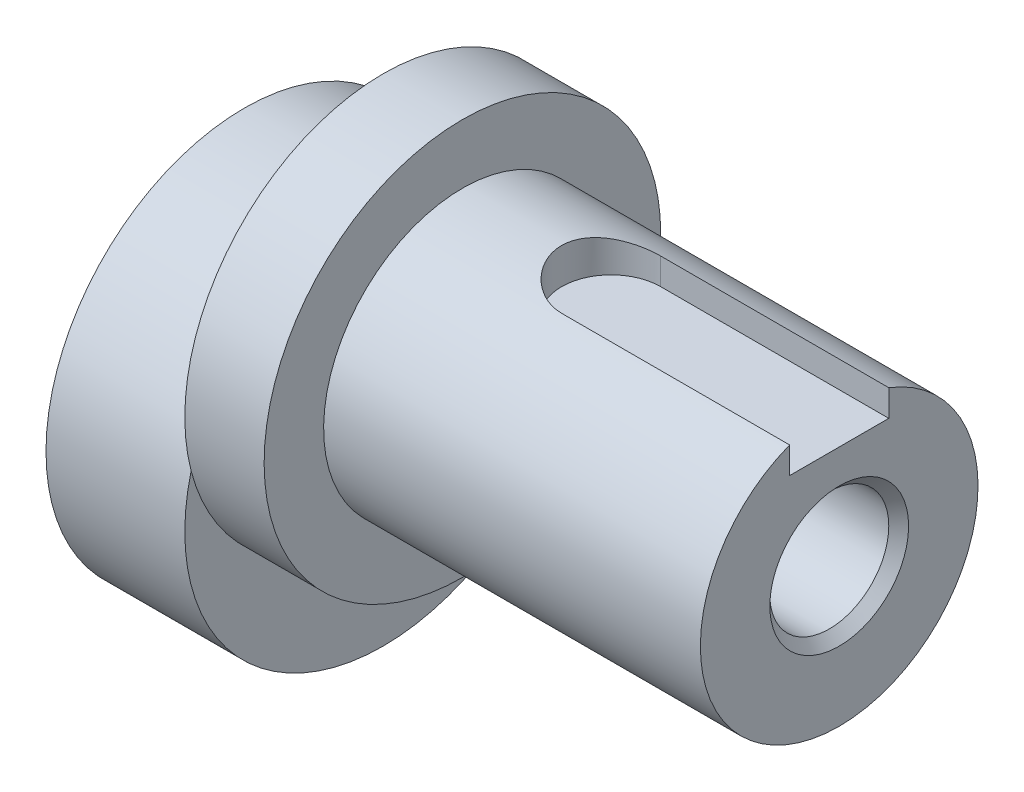
ISO-10303-21;
HEADER;
FILE_DESCRIPTION(('STEP AP214'),'2;1');
FILE_NAME('part.step','',(''),(''),'','','');
FILE_SCHEMA(('AUTOMOTIVE_DESIGN { 1 0 10303 214 1 1 1 1 }'));
ENDSEC;
DATA;
#1=APPLICATION_CONTEXT('core data for automotive mechanical design processes');
#2=APPLICATION_PROTOCOL_DEFINITION('international standard','automotive_design',2000,#1);
#3=PRODUCT_CONTEXT('',#1,'mechanical');
#4=PRODUCT('Part','Part','',(#3));
#5=PRODUCT_RELATED_PRODUCT_CATEGORY('part','',(#4));
#6=PRODUCT_DEFINITION_FORMATION('','',#4);
#7=PRODUCT_DEFINITION_CONTEXT('part definition',#1,'design');
#8=PRODUCT_DEFINITION('design','',#6,#7);
#9=PRODUCT_DEFINITION_SHAPE('','',#8);
#10=(LENGTH_UNIT() NAMED_UNIT(*) SI_UNIT(.MILLI.,.METRE.));
#11=(NAMED_UNIT(*) PLANE_ANGLE_UNIT() SI_UNIT($,.RADIAN.));
#12=(NAMED_UNIT(*) SI_UNIT($,.STERADIAN.) SOLID_ANGLE_UNIT());
#13=UNCERTAINTY_MEASURE_WITH_UNIT(LENGTH_MEASURE(1.E-05),#10,'distance_accuracy_value','');
#14=(GEOMETRIC_REPRESENTATION_CONTEXT(3) GLOBAL_UNCERTAINTY_ASSIGNED_CONTEXT((#13)) GLOBAL_UNIT_ASSIGNED_CONTEXT((#10,
#11,#12)) REPRESENTATION_CONTEXT('',''));
#15=CARTESIAN_POINT('',(0.,0.,0.));
#16=DIRECTION('',(0.,0.,1.));
#17=DIRECTION('',(1.,0.,0.));
#18=AXIS2_PLACEMENT_3D('',#15,#16,#17);
#19=CARTESIAN_POINT('',(30.,5.,0.));
#20=DIRECTION('',(-1.,0.,0.));
#21=DIRECTION('',(0.,0.,1.));
#22=AXIS2_PLACEMENT_3D('',#19,#20,#21);
#23=CYLINDRICAL_SURFACE('',#22,7.);
#24=CARTESIAN_POINT('',(11.,5.,0.));
#25=DIRECTION('',(1.,0.,0.));
#26=DIRECTION('',(0.,0.,-1.));
#27=AXIS2_PLACEMENT_3D('',#24,#25,#26);
#28=CIRCLE('',#27,7.);
#29=CARTESIAN_POINT('',(11.,5.,-7.));
#30=VERTEX_POINT('',#29);
#31=EDGE_CURVE('E111',#30,#30,#28,.T.);
#32=ORIENTED_EDGE('',*,*,#31,.T.);
#33=EDGE_LOOP('',(#32));
#34=FACE_BOUND('',#33,.T.);
#35=DIRECTION('',(-1.,0.,0.));
#36=VECTOR('',#35,1.);
#37=CARTESIAN_POINT('',(30.,11.538348415311,2.5));
#38=LINE('',#37,#36);
#39=CARTESIAN_POINT('',(18.5,11.538348415311,2.5));
#40=VERTEX_POINT('',#39);
#41=CARTESIAN_POINT('',(30.,11.538348415311,2.5));
#42=VERTEX_POINT('',#41);
#43=EDGE_CURVE('E109',#40,#42,#38,.F.);
#44=ORIENTED_EDGE('',*,*,#43,.F.);
#45=CARTESIAN_POINT('',(18.5,11.538348415311,-2.5));
#46=CARTESIAN_POINT('',(18.4321107542711,11.5383365378513,-2.50000932220903));
#47=CARTESIAN_POINT('',(18.3642280673609,11.5394054992274,-2.49723485076694));
#48=CARTESIAN_POINT('',(18.2289960893886,11.5436165747813,-2.4861910211816));
#49=CARTESIAN_POINT('',(18.1616466413939,11.5467580541806,-2.47792334551208));
#50=CARTESIAN_POINT('',(18.0281785853972,11.5550121763794,-2.456001752859));
#51=CARTESIAN_POINT('',(17.9620566636602,11.5601183170568,-2.44236559963955));
#52=CARTESIAN_POINT('',(17.8312981648915,11.5721317785418,-2.40985115466648));
#53=CARTESIAN_POINT('',(17.7666616536876,11.5790391790075,-2.39097263107435));
#54=CARTESIAN_POINT('',(17.5757356335225,11.6021493436571,-2.32673964179204));
#55=CARTESIAN_POINT('',(17.4522095478644,11.6207547534084,-2.27375112606986));
#56=CARTESIAN_POINT('',(17.215769666872,11.6622539736071,-2.14910757865425));
#57=CARTESIAN_POINT('',(17.1028636832645,11.6851509042488,-2.07743895048849));
#58=CARTESIAN_POINT('',(16.8857847866473,11.7337991379222,-1.91402571101969));
#59=CARTESIAN_POINT('',(16.7821535248041,11.7596286404137,-1.82158337146743));
#60=CARTESIAN_POINT('',(16.5914912952836,11.8105759232303,-1.6207338877633));
#61=CARTESIAN_POINT('',(16.5044634207567,11.8356935701987,-1.51232377552673));
#62=CARTESIAN_POINT('',(16.346910144545,11.8833113327905,-1.27853915335934));
#63=CARTESIAN_POINT('',(16.2769684781395,11.905708352238,-1.15274833789185));
#64=CARTESIAN_POINT('',(16.1594633532026,11.9444235767263,-0.890250825476632));
#65=CARTESIAN_POINT('',(16.111892220954,11.9607438658547,-0.753547890540324));
#66=CARTESIAN_POINT('',(16.0423593978176,11.9849105051071,-0.478829979256172));
#67=CARTESIAN_POINT('',(16.0194608695289,11.9930659435251,-0.341079835227463));
#68=CARTESIAN_POINT('',(15.9969315972224,12.0010879805382,-0.0634643052969002));
#69=CARTESIAN_POINT('',(15.9972944139654,12.000956873027,0.0764004845074518));
#70=CARTESIAN_POINT('',(16.0207112737611,11.9926225804908,0.347593258486949));
#71=CARTESIAN_POINT('',(16.0427447941985,11.9847824358352,0.479022407078724));
#72=CARTESIAN_POINT('',(16.1071734241588,11.9623783250735,0.736175812143611));
#73=CARTESIAN_POINT('',(16.1495696843625,11.9478139789904,0.861899745780467));
#74=CARTESIAN_POINT('',(16.2540469115653,11.9131650689037,1.10616102429808));
#75=CARTESIAN_POINT('',(16.3163957149601,11.8930059216431,1.22457279066907));
#76=CARTESIAN_POINT('',(16.4587793352234,11.8492335561632,1.44953531305524));
#77=CARTESIAN_POINT('',(16.5388195237836,11.8256192895926,1.55608245176771));
#78=CARTESIAN_POINT('',(16.7193232636567,11.7759054780549,1.7603244525607));
#79=CARTESIAN_POINT('',(16.8206497231449,11.7497405584388,1.85724185700418));
#80=CARTESIAN_POINT('',(17.0383273641656,11.6989034246897,2.03299914621297));
#81=CARTESIAN_POINT('',(17.1546839051685,11.6742317476526,2.11183255456463));
#82=CARTESIAN_POINT('',(17.401942598522,11.628778038754,2.25049860898459));
#83=CARTESIAN_POINT('',(17.5330789755054,11.6080787511899,2.30994207989626));
#84=CARTESIAN_POINT('',(17.8043648015822,11.5738821361027,2.4055543972585));
#85=CARTESIAN_POINT('',(17.944499141169,11.5603730716505,2.44176119399954));
#86=CARTESIAN_POINT('',(18.1550305442642,11.5470854224556,2.47705497148627));
#87=CARTESIAN_POINT('',(18.2237363017718,11.5438201096791,2.48565347586445));
#88=CARTESIAN_POINT('',(18.3616151641917,11.5394491082968,2.49712352174882));
#89=CARTESIAN_POINT('',(18.4307876671005,11.5383410314093,2.50000139665367));
#90=CARTESIAN_POINT('',(18.5,11.538348415311,2.5));
#91=B_SPLINE_CURVE_WITH_KNOTS('',3,(#45,#46,#47,#48,#49,#50,#51,#52,#53,#54,#55,#56,#57,#58,#59,
#60,#61,#62,#63,#64,#65,#66,#67,#68,#69,#70,#71,#72,#73,#74,#75,#76,#77,#78,#79,#80,#81,#82,#83,
#84,#85,#86,#87,#88,#89,#90),.UNSPECIFIED.,.F.,.F.,(4,2,2,2,2,2,2,2,2,2,2,2,2,2,2,2,2,2,2,2,2,2,
4),(0.,0.203591628551585,0.407120929225524,0.609982356545741,0.812852756635989,1.21793118555512,
1.6233052814847,2.0451597231193,2.4670926781184,2.90188398965561,3.33652604665237,
3.75400993940861,4.17137826416922,4.56998920861347,4.96862268086888,5.37284909448639,
5.77719841367921,6.20315837945087,6.62927065674721,7.06347329058505,7.49696496492444,
7.70468580162772,7.91217653896403),.UNSPECIFIED.);
#92=CARTESIAN_POINT('',(18.5,11.538348415311,-2.5));
#93=VERTEX_POINT('',#92);
#94=EDGE_CURVE('E11',#93,#40,#91,.T.);
#95=ORIENTED_EDGE('',*,*,#94,.F.);
#96=DIRECTION('',(-1.,0.,0.));
#97=VECTOR('',#96,1.);
#98=CARTESIAN_POINT('',(30.,11.538348415311,-2.5));
#99=LINE('',#98,#97);
#100=CARTESIAN_POINT('',(30.,11.538348415311,-2.5));
#101=VERTEX_POINT('',#100);
#102=EDGE_CURVE('E93',#101,#93,#99,.T.);
#103=ORIENTED_EDGE('',*,*,#102,.F.);
#104=CARTESIAN_POINT('',(30.,5.,0.));
#105=DIRECTION('',(1.,0.,0.));
#106=DIRECTION('',(0.,0.,-1.));
#107=AXIS2_PLACEMENT_3D('',#104,#105,#106);
#108=CIRCLE('',#107,7.);
#109=EDGE_CURVE('E112',#42,#101,#108,.T.);
#110=ORIENTED_EDGE('',*,*,#109,.F.);
#111=EDGE_LOOP('',(#44,#95,#103,#110));
#112=FACE_BOUND('',#111,.T.);
#113=ADVANCED_FACE('F32',(#34,#112),#23,.T.);
#114=CARTESIAN_POINT('',(30.,5.,0.));
#115=DIRECTION('',(1.,0.,0.));
#116=DIRECTION('',(0.,0.,-1.));
#117=AXIS2_PLACEMENT_3D('',#114,#115,#116);
#118=PLANE('',#117);
#119=CARTESIAN_POINT('',(30.,5.,0.));
#120=DIRECTION('',(1.,0.,0.));
#121=DIRECTION('',(0.,0.,-1.));
#122=AXIS2_PLACEMENT_3D('',#119,#120,#121);
#123=CIRCLE('',#122,3.50000000000002);
#124=CARTESIAN_POINT('',(30.,5.,-3.50000000000002));
#125=VERTEX_POINT('',#124);
#126=EDGE_CURVE('E138',#125,#125,#123,.F.);
#127=ORIENTED_EDGE('',*,*,#126,.T.);
#128=EDGE_LOOP('',(#127));
#129=FACE_BOUND('',#128,.T.);
#130=DIRECTION('',(0.,0.,1.));
#131=VECTOR('',#130,1.);
#132=CARTESIAN_POINT('',(30.,10.2,0.));
#133=LINE('',#132,#131);
#134=CARTESIAN_POINT('',(30.,10.2,-2.5));
#135=VERTEX_POINT('',#134);
#136=CARTESIAN_POINT('',(30.,10.2,2.5));
#137=VERTEX_POINT('',#136);
#138=EDGE_CURVE('E141',#135,#137,#133,.T.);
#139=ORIENTED_EDGE('',*,*,#138,.T.);
#140=DIRECTION('',(0.,1.,0.));
#141=VECTOR('',#140,1.);
#142=CARTESIAN_POINT('',(30.,5.,2.5));
#143=LINE('',#142,#141);
#144=EDGE_CURVE('E46',#137,#42,#143,.T.);
#145=ORIENTED_EDGE('',*,*,#144,.T.);
#146=ORIENTED_EDGE('',*,*,#109,.T.);
#147=DIRECTION('',(0.,-1.,0.));
#148=VECTOR('',#147,1.);
#149=CARTESIAN_POINT('',(30.,5.,-2.5));
#150=LINE('',#149,#148);
#151=EDGE_CURVE('E143',#101,#135,#150,.T.);
#152=ORIENTED_EDGE('',*,*,#151,.T.);
#153=EDGE_LOOP('',(#139,#145,#146,#152));
#154=FACE_BOUND('',#153,.T.);
#155=ADVANCED_FACE('F147',(#129,#154),#118,.T.);
#156=CARTESIAN_POINT('',(7.,0.,0.));
#157=DIRECTION('',(-1.,0.,0.));
#158=DIRECTION('',(0.,0.,1.));
#159=AXIS2_PLACEMENT_3D('',#156,#157,#158);
#160=CYLINDRICAL_SURFACE('',#159,10.);
#161=CARTESIAN_POINT('',(7.,0.,0.));
#162=DIRECTION('',(1.,0.,0.));
#163=DIRECTION('',(0.,0.,-1.));
#164=AXIS2_PLACEMENT_3D('',#161,#162,#163);
#165=CIRCLE('',#164,10.);
#166=CARTESIAN_POINT('',(7.,2.5,-9.68245836551854));
#167=VERTEX_POINT('',#166);
#168=CARTESIAN_POINT('',(7.,2.5,9.68245836551854));
#169=VERTEX_POINT('',#168);
#170=EDGE_CURVE('E123',#167,#169,#165,.T.);
#171=ORIENTED_EDGE('',*,*,#170,.F.);
#172=EDGE_CURVE('E127',#169,#167,#165,.T.);
#173=ORIENTED_EDGE('',*,*,#172,.F.);
#174=EDGE_LOOP('',(#171,#173));
#175=FACE_BOUND('',#174,.T.);
#176=CARTESIAN_POINT('',(0.,0.,0.));
#177=DIRECTION('',(1.,0.,0.));
#178=DIRECTION('',(0.,0.,-1.));
#179=AXIS2_PLACEMENT_3D('',#176,#177,#178);
#180=CIRCLE('',#179,10.);
#181=CARTESIAN_POINT('',(0.,0.,-10.));
#182=VERTEX_POINT('',#181);
#183=EDGE_CURVE('E121',#182,#182,#180,.T.);
#184=ORIENTED_EDGE('',*,*,#183,.T.);
#185=EDGE_LOOP('',(#184));
#186=FACE_BOUND('',#185,.T.);
#187=ADVANCED_FACE('F165',(#175,#186),#160,.T.);
#188=CARTESIAN_POINT('',(7.,0.,0.));
#189=DIRECTION('',(1.,0.,0.));
#190=DIRECTION('',(0.,0.,-1.));
#191=AXIS2_PLACEMENT_3D('',#188,#189,#190);
#192=PLANE('',#191);
#193=CARTESIAN_POINT('',(7.,5.,0.));
#194=DIRECTION('',(1.,0.,0.));
#195=DIRECTION('',(0.,0.,-1.));
#196=AXIS2_PLACEMENT_3D('',#193,#194,#195);
#197=CIRCLE('',#196,10.);
#198=EDGE_CURVE('E60',#169,#167,#197,.T.);
#199=ORIENTED_EDGE('',*,*,#198,.F.);
#200=ORIENTED_EDGE('',*,*,#172,.T.);
#201=EDGE_LOOP('',(#199,#200));
#202=FACE_BOUND('',#201,.T.);
#203=ADVANCED_FACE('F185',(#202),#192,.T.);
#204=CARTESIAN_POINT('',(0.,0.,0.));
#205=DIRECTION('',(1.,0.,0.));
#206=DIRECTION('',(0.,0.,-1.));
#207=AXIS2_PLACEMENT_3D('',#204,#205,#206);
#208=PLANE('',#207);
#209=CARTESIAN_POINT('',(0.,5.,0.));
#210=DIRECTION('',(1.,0.,0.));
#211=DIRECTION('',(0.,0.,-1.));
#212=AXIS2_PLACEMENT_3D('',#209,#210,#211);
#213=CIRCLE('',#212,3.5);
#214=CARTESIAN_POINT('',(0.,5.,-3.5));
#215=VERTEX_POINT('',#214);
#216=EDGE_CURVE('E126',#215,#215,#213,.T.);
#217=ORIENTED_EDGE('',*,*,#216,.T.);
#218=EDGE_LOOP('',(#217));
#219=FACE_BOUND('',#218,.T.);
#220=ORIENTED_EDGE('',*,*,#183,.F.);
#221=EDGE_LOOP('',(#220));
#222=FACE_BOUND('',#221,.T.);
#223=ADVANCED_FACE('F180',(#219,#222),#208,.F.);
#224=CARTESIAN_POINT('',(7.,5.,0.));
#225=DIRECTION('',(1.,0.,0.));
#226=DIRECTION('',(0.,0.,-1.));
#227=AXIS2_PLACEMENT_3D('',#224,#225,#226);
#228=PLANE('',#227);
#229=EDGE_CURVE('E115',#167,#169,#197,.T.);
#230=ORIENTED_EDGE('',*,*,#229,.F.);
#231=ORIENTED_EDGE('',*,*,#170,.T.);
#232=EDGE_LOOP('',(#230,#231));
#233=FACE_BOUND('',#232,.T.);
#234=ADVANCED_FACE('F177',(#233),#228,.F.);
#235=CARTESIAN_POINT('',(11.,5.,0.));
#236=DIRECTION('',(-1.,0.,0.));
#237=DIRECTION('',(0.,0.,1.));
#238=AXIS2_PLACEMENT_3D('',#235,#236,#237);
#239=CYLINDRICAL_SURFACE('',#238,10.);
#240=CARTESIAN_POINT('',(11.,5.,0.));
#241=DIRECTION('',(1.,0.,0.));
#242=DIRECTION('',(0.,0.,-1.));
#243=AXIS2_PLACEMENT_3D('',#240,#241,#242);
#244=CIRCLE('',#243,10.);
#245=CARTESIAN_POINT('',(11.,5.,-10.));
#246=VERTEX_POINT('',#245);
#247=EDGE_CURVE('E118',#246,#246,#244,.T.);
#248=ORIENTED_EDGE('',*,*,#247,.F.);
#249=EDGE_LOOP('',(#248));
#250=FACE_BOUND('',#249,.T.);
#251=ORIENTED_EDGE('',*,*,#198,.T.);
#252=ORIENTED_EDGE('',*,*,#229,.T.);
#253=EDGE_LOOP('',(#251,#252));
#254=FACE_BOUND('',#253,.T.);
#255=ADVANCED_FACE('F175',(#250,#254),#239,.T.);
#256=CARTESIAN_POINT('',(11.,5.,0.));
#257=DIRECTION('',(1.,0.,0.));
#258=DIRECTION('',(0.,0.,-1.));
#259=AXIS2_PLACEMENT_3D('',#256,#257,#258);
#260=PLANE('',#259);
#261=ORIENTED_EDGE('',*,*,#31,.F.);
#262=EDGE_LOOP('',(#261));
#263=FACE_BOUND('',#262,.T.);
#264=ORIENTED_EDGE('',*,*,#247,.T.);
#265=EDGE_LOOP('',(#264));
#266=FACE_BOUND('',#265,.T.);
#267=ADVANCED_FACE('F171',(#263,#266),#260,.T.);
#268=CARTESIAN_POINT('',(0.,5.,0.));
#269=DIRECTION('',(1.,0.,0.));
#270=DIRECTION('',(0.,0.,-1.));
#271=AXIS2_PLACEMENT_3D('',#268,#269,#270);
#272=CYLINDRICAL_SURFACE('',#271,3.);
#273=CARTESIAN_POINT('',(0.500000000000003,5.,0.));
#274=DIRECTION('',(1.,0.,0.));
#275=DIRECTION('',(0.,0.,-1.));
#276=AXIS2_PLACEMENT_3D('',#273,#274,#275);
#277=CIRCLE('',#276,3.);
#278=CARTESIAN_POINT('',(0.500000000000003,5.,-3.));
#279=VERTEX_POINT('',#278);
#280=EDGE_CURVE('E135',#279,#279,#277,.F.);
#281=ORIENTED_EDGE('',*,*,#280,.T.);
#282=EDGE_LOOP('',(#281));
#283=FACE_BOUND('',#282,.T.);
#284=CARTESIAN_POINT('',(29.5,5.,0.));
#285=DIRECTION('',(1.,0.,0.));
#286=DIRECTION('',(0.,0.,-1.));
#287=AXIS2_PLACEMENT_3D('',#284,#285,#286);
#288=CIRCLE('',#287,3.);
#289=CARTESIAN_POINT('',(29.5,5.,-3.));
#290=VERTEX_POINT('',#289);
#291=EDGE_CURVE('E132',#290,#290,#288,.T.);
#292=ORIENTED_EDGE('',*,*,#291,.T.);
#293=EDGE_LOOP('',(#292));
#294=FACE_BOUND('',#293,.T.);
#295=ADVANCED_FACE('F174',(#283,#294),#272,.F.);
#296=CARTESIAN_POINT('',(0.,5.,0.));
#297=DIRECTION('',(-1.,0.,0.));
#298=DIRECTION('',(0.,0.,1.));
#299=AXIS2_PLACEMENT_3D('',#296,#297,#298);
#300=CONICAL_SURFACE('',#299,3.5,0.785398163397445);
#301=ORIENTED_EDGE('',*,*,#280,.F.);
#302=EDGE_LOOP('',(#301));
#303=FACE_BOUND('',#302,.T.);
#304=ORIENTED_EDGE('',*,*,#216,.F.);
#305=EDGE_LOOP('',(#304));
#306=FACE_BOUND('',#305,.T.);
#307=ADVANCED_FACE('F193',(#303,#306),#300,.F.);
#308=CARTESIAN_POINT('',(29.5,5.,0.));
#309=DIRECTION('',(1.,0.,0.));
#310=DIRECTION('',(0.,0.,-1.));
#311=AXIS2_PLACEMENT_3D('',#308,#309,#310);
#312=CONICAL_SURFACE('',#311,3.,0.785398163397451);
#313=ORIENTED_EDGE('',*,*,#126,.F.);
#314=EDGE_LOOP('',(#313));
#315=FACE_BOUND('',#314,.T.);
#316=ORIENTED_EDGE('',*,*,#291,.F.);
#317=EDGE_LOOP('',(#316));
#318=FACE_BOUND('',#317,.T.);
#319=ADVANCED_FACE('F34',(#315,#318),#312,.F.);
#320=CARTESIAN_POINT('',(18.5,15.,0.));
#321=DIRECTION('',(0.,-1.,0.));
#322=DIRECTION('',(0.,0.,-1.));
#323=AXIS2_PLACEMENT_3D('',#320,#321,#322);
#324=CYLINDRICAL_SURFACE('',#323,2.5);
#325=ORIENTED_EDGE('',*,*,#94,.T.);
#326=DIRECTION('',(0.,-1.,0.));
#327=VECTOR('',#326,1.);
#328=CARTESIAN_POINT('',(18.5,15.,2.5));
#329=LINE('',#328,#327);
#330=CARTESIAN_POINT('',(18.5,10.2,2.5));
#331=VERTEX_POINT('',#330);
#332=EDGE_CURVE('E86',#40,#331,#329,.T.);
#333=ORIENTED_EDGE('',*,*,#332,.T.);
#334=CARTESIAN_POINT('',(18.5,10.2,0.));
#335=DIRECTION('',(0.,1.,0.));
#336=DIRECTION('',(0.,0.,1.));
#337=AXIS2_PLACEMENT_3D('',#334,#335,#336);
#338=CIRCLE('',#337,2.5);
#339=CARTESIAN_POINT('',(18.5,10.2,-2.5));
#340=VERTEX_POINT('',#339);
#341=EDGE_CURVE('E89',#340,#331,#338,.T.);
#342=ORIENTED_EDGE('',*,*,#341,.F.);
#343=DIRECTION('',(0.,-1.,0.));
#344=VECTOR('',#343,1.);
#345=CARTESIAN_POINT('',(18.5,15.,-2.5));
#346=LINE('',#345,#344);
#347=EDGE_CURVE('E94',#93,#340,#346,.T.);
#348=ORIENTED_EDGE('',*,*,#347,.F.);
#349=EDGE_LOOP('',(#325,#333,#342,#348));
#350=FACE_BOUND('',#349,.T.);
#351=ADVANCED_FACE('F87',(#350),#324,.F.);
#352=CARTESIAN_POINT('',(30.,15.,2.5));
#353=DIRECTION('',(0.,0.,-1.));
#354=DIRECTION('',(-1.,0.,0.));
#355=AXIS2_PLACEMENT_3D('',#352,#353,#354);
#356=PLANE('',#355);
#357=ORIENTED_EDGE('',*,*,#43,.T.);
#358=ORIENTED_EDGE('',*,*,#144,.F.);
#359=DIRECTION('',(1.,0.,0.));
#360=VECTOR('',#359,1.);
#361=CARTESIAN_POINT('',(30.,10.2,2.5));
#362=LINE('',#361,#360);
#363=EDGE_CURVE('E53',#331,#137,#362,.T.);
#364=ORIENTED_EDGE('',*,*,#363,.F.);
#365=ORIENTED_EDGE('',*,*,#332,.F.);
#366=EDGE_LOOP('',(#357,#358,#364,#365));
#367=FACE_BOUND('',#366,.T.);
#368=ADVANCED_FACE('F96',(#367),#356,.T.);
#369=CARTESIAN_POINT('',(30.,15.,-2.5));
#370=DIRECTION('',(0.,0.,1.));
#371=DIRECTION('',(1.,0.,0.));
#372=AXIS2_PLACEMENT_3D('',#369,#370,#371);
#373=PLANE('',#372);
#374=ORIENTED_EDGE('',*,*,#102,.T.);
#375=ORIENTED_EDGE('',*,*,#347,.T.);
#376=DIRECTION('',(-1.,0.,0.));
#377=VECTOR('',#376,1.);
#378=CARTESIAN_POINT('',(30.,10.2,-2.5));
#379=LINE('',#378,#377);
#380=EDGE_CURVE('E99',#135,#340,#379,.T.);
#381=ORIENTED_EDGE('',*,*,#380,.F.);
#382=ORIENTED_EDGE('',*,*,#151,.F.);
#383=EDGE_LOOP('',(#374,#375,#381,#382));
#384=FACE_BOUND('',#383,.T.);
#385=ADVANCED_FACE('F151',(#384),#373,.T.);
#386=CARTESIAN_POINT('',(18.5,10.2,0.));
#387=DIRECTION('',(0.,1.,0.));
#388=DIRECTION('',(0.,0.,1.));
#389=AXIS2_PLACEMENT_3D('',#386,#387,#388);
#390=PLANE('',#389);
#391=ORIENTED_EDGE('',*,*,#380,.T.);
#392=ORIENTED_EDGE('',*,*,#341,.T.);
#393=ORIENTED_EDGE('',*,*,#363,.T.);
#394=ORIENTED_EDGE('',*,*,#138,.F.);
#395=EDGE_LOOP('',(#391,#392,#393,#394));
#396=FACE_BOUND('',#395,.T.);
#397=ADVANCED_FACE('F102',(#396),#390,.T.);
#398=CLOSED_SHELL('',(#113,#155,#187,#203,#223,#234,#255,#267,#295,#307,#319,#351,#368,#385,#397));
#399=MANIFOLD_SOLID_BREP('B2',#398);
#400=ADVANCED_BREP_SHAPE_REPRESENTATION('',(#18,#399),#14);
#401=SHAPE_DEFINITION_REPRESENTATION(#9,#400);
ENDSEC;
END-ISO-10303-21;
